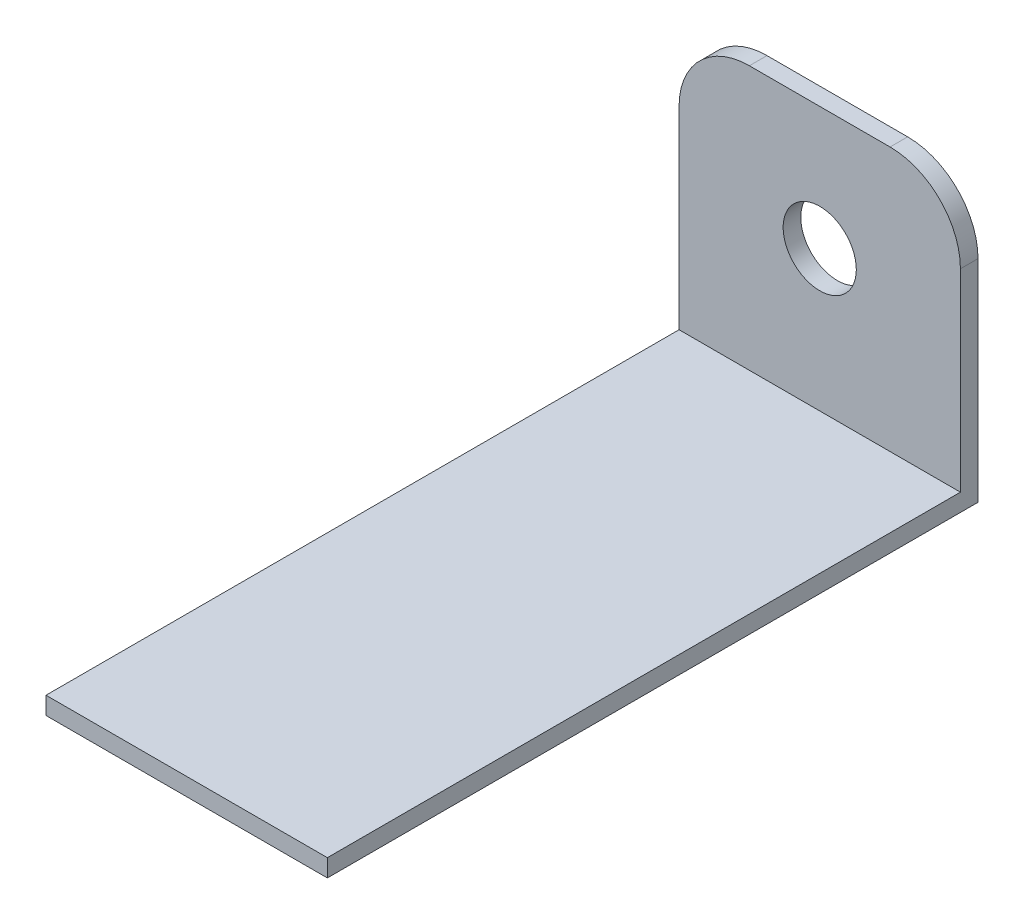
ISO-10303-21;
HEADER;
FILE_DESCRIPTION(('STEP AP214'),'2;1');
FILE_NAME('part.step','',(''),(''),'','','');
FILE_SCHEMA(('AUTOMOTIVE_DESIGN { 1 0 10303 214 1 1 1 1 }'));
ENDSEC;
DATA;
#1=APPLICATION_CONTEXT('core data for automotive mechanical design processes');
#2=APPLICATION_PROTOCOL_DEFINITION('international standard','automotive_design',2000,#1);
#3=PRODUCT_CONTEXT('',#1,'mechanical');
#4=PRODUCT('Part','Part','',(#3));
#5=PRODUCT_RELATED_PRODUCT_CATEGORY('part','',(#4));
#6=PRODUCT_DEFINITION_FORMATION('','',#4);
#7=PRODUCT_DEFINITION_CONTEXT('part definition',#1,'design');
#8=PRODUCT_DEFINITION('design','',#6,#7);
#9=PRODUCT_DEFINITION_SHAPE('','',#8);
#10=(LENGTH_UNIT() NAMED_UNIT(*) SI_UNIT(.MILLI.,.METRE.));
#11=(NAMED_UNIT(*) PLANE_ANGLE_UNIT() SI_UNIT($,.RADIAN.));
#12=(NAMED_UNIT(*) SI_UNIT($,.STERADIAN.) SOLID_ANGLE_UNIT());
#13=UNCERTAINTY_MEASURE_WITH_UNIT(LENGTH_MEASURE(1.E-05),#10,'distance_accuracy_value','');
#14=(GEOMETRIC_REPRESENTATION_CONTEXT(3) GLOBAL_UNCERTAINTY_ASSIGNED_CONTEXT((#13)) GLOBAL_UNIT_ASSIGNED_CONTEXT((#10,
#11,#12)) REPRESENTATION_CONTEXT('',''));
#15=CARTESIAN_POINT('',(0.,0.,0.));
#16=DIRECTION('',(0.,0.,1.));
#17=DIRECTION('',(1.,0.,0.));
#18=AXIS2_PLACEMENT_3D('',#15,#16,#17);
#19=CARTESIAN_POINT('',(0.,1.5875,0.));
#20=DIRECTION('',(1.,0.,0.));
#21=DIRECTION('',(0.,0.,-1.));
#22=AXIS2_PLACEMENT_3D('',#19,#20,#21);
#23=PLANE('',#22);
#24=DIRECTION('',(0.,1.,0.));
#25=VECTOR('',#24,1.);
#26=CARTESIAN_POINT('',(0.,0.,-57.15));
#27=LINE('',#26,#25);
#28=CARTESIAN_POINT('',(0.,1.5875,-57.15));
#29=VERTEX_POINT('',#28);
#30=CARTESIAN_POINT('',(0.,19.05,-57.15));
#31=VERTEX_POINT('',#30);
#32=EDGE_CURVE('E140',#29,#31,#27,.T.);
#33=ORIENTED_EDGE('',*,*,#32,.T.);
#34=DIRECTION('',(0.,0.,1.));
#35=VECTOR('',#34,1.);
#36=CARTESIAN_POINT('',(0.,19.05,0.));
#37=LINE('',#36,#35);
#38=CARTESIAN_POINT('',(0.,19.05,-58.7375));
#39=VERTEX_POINT('',#38);
#40=EDGE_CURVE('E11',#31,#39,#37,.F.);
#41=ORIENTED_EDGE('',*,*,#40,.T.);
#42=DIRECTION('',(0.,1.,0.));
#43=VECTOR('',#42,1.);
#44=CARTESIAN_POINT('',(0.,0.,-58.7375));
#45=LINE('',#44,#43);
#46=CARTESIAN_POINT('',(0.,0.,-58.7375));
#47=VERTEX_POINT('',#46);
#48=EDGE_CURVE('E131',#47,#39,#45,.T.);
#49=ORIENTED_EDGE('',*,*,#48,.F.);
#50=DIRECTION('',(0.,0.,1.));
#51=VECTOR('',#50,1.);
#52=CARTESIAN_POINT('',(0.,0.,0.));
#53=LINE('',#52,#51);
#54=CARTESIAN_POINT('',(0.,0.,0.));
#55=VERTEX_POINT('',#54);
#56=EDGE_CURVE('E130',#47,#55,#53,.T.);
#57=ORIENTED_EDGE('',*,*,#56,.T.);
#58=DIRECTION('',(0.,-1.,0.));
#59=VECTOR('',#58,1.);
#60=CARTESIAN_POINT('',(0.,1.5875,0.));
#61=LINE('',#60,#59);
#62=CARTESIAN_POINT('',(0.,1.5875,0.));
#63=VERTEX_POINT('',#62);
#64=EDGE_CURVE('E157',#63,#55,#61,.T.);
#65=ORIENTED_EDGE('',*,*,#64,.F.);
#66=DIRECTION('',(0.,0.,1.));
#67=VECTOR('',#66,1.);
#68=CARTESIAN_POINT('',(0.,1.5875,0.));
#69=LINE('',#68,#67);
#70=EDGE_CURVE('E125',#29,#63,#69,.T.);
#71=ORIENTED_EDGE('',*,*,#70,.F.);
#72=EDGE_LOOP('',(#33,#41,#49,#57,#65,#71));
#73=FACE_BOUND('',#72,.T.);
#74=ADVANCED_FACE('F39',(#73),#23,.F.);
#75=CARTESIAN_POINT('',(0.,1.5875,0.));
#76=DIRECTION('',(0.,0.,-1.));
#77=DIRECTION('',(-1.,0.,0.));
#78=AXIS2_PLACEMENT_3D('',#75,#76,#77);
#79=PLANE('',#78);
#80=DIRECTION('',(1.,0.,0.));
#81=VECTOR('',#80,1.);
#82=CARTESIAN_POINT('',(0.,0.,0.));
#83=LINE('',#82,#81);
#84=CARTESIAN_POINT('',(25.4,0.,0.));
#85=VERTEX_POINT('',#84);
#86=EDGE_CURVE('E126',#55,#85,#83,.T.);
#87=ORIENTED_EDGE('',*,*,#86,.T.);
#88=DIRECTION('',(0.,-1.,0.));
#89=VECTOR('',#88,1.);
#90=CARTESIAN_POINT('',(25.4,1.5875,0.));
#91=LINE('',#90,#89);
#92=CARTESIAN_POINT('',(25.4,1.5875,0.));
#93=VERTEX_POINT('',#92);
#94=EDGE_CURVE('E123',#93,#85,#91,.T.);
#95=ORIENTED_EDGE('',*,*,#94,.F.);
#96=DIRECTION('',(1.,0.,0.));
#97=VECTOR('',#96,1.);
#98=CARTESIAN_POINT('',(0.,1.5875,0.));
#99=LINE('',#98,#97);
#100=EDGE_CURVE('E146',#63,#93,#99,.T.);
#101=ORIENTED_EDGE('',*,*,#100,.F.);
#102=ORIENTED_EDGE('',*,*,#64,.T.);
#103=EDGE_LOOP('',(#87,#95,#101,#102));
#104=FACE_BOUND('',#103,.T.);
#105=ADVANCED_FACE('F197',(#104),#79,.F.);
#106=CARTESIAN_POINT('',(25.4,1.5875,0.));
#107=DIRECTION('',(-1.,0.,0.));
#108=DIRECTION('',(0.,0.,1.));
#109=AXIS2_PLACEMENT_3D('',#106,#107,#108);
#110=PLANE('',#109);
#111=DIRECTION('',(0.,-1.,0.));
#112=VECTOR('',#111,1.);
#113=CARTESIAN_POINT('',(25.4,0.,-58.7375));
#114=LINE('',#113,#112);
#115=CARTESIAN_POINT('',(25.4,19.05,-58.7375));
#116=VERTEX_POINT('',#115);
#117=CARTESIAN_POINT('',(25.4,0.,-58.7375));
#118=VERTEX_POINT('',#117);
#119=EDGE_CURVE('E106',#116,#118,#114,.T.);
#120=ORIENTED_EDGE('',*,*,#119,.F.);
#121=DIRECTION('',(0.,0.,1.));
#122=VECTOR('',#121,1.);
#123=CARTESIAN_POINT('',(25.4,19.05,0.));
#124=LINE('',#123,#122);
#125=CARTESIAN_POINT('',(25.4,19.05,-57.15));
#126=VERTEX_POINT('',#125);
#127=EDGE_CURVE('E160',#116,#126,#124,.T.);
#128=ORIENTED_EDGE('',*,*,#127,.T.);
#129=DIRECTION('',(0.,-1.,0.));
#130=VECTOR('',#129,1.);
#131=CARTESIAN_POINT('',(25.4,0.,-57.15));
#132=LINE('',#131,#130);
#133=CARTESIAN_POINT('',(25.4,1.5875,-57.15));
#134=VERTEX_POINT('',#133);
#135=EDGE_CURVE('E138',#126,#134,#132,.T.);
#136=ORIENTED_EDGE('',*,*,#135,.T.);
#137=DIRECTION('',(0.,0.,-1.));
#138=VECTOR('',#137,1.);
#139=CARTESIAN_POINT('',(25.4,1.5875,0.));
#140=LINE('',#139,#138);
#141=EDGE_CURVE('E148',#93,#134,#140,.T.);
#142=ORIENTED_EDGE('',*,*,#141,.F.);
#143=ORIENTED_EDGE('',*,*,#94,.T.);
#144=DIRECTION('',(0.,0.,-1.));
#145=VECTOR('',#144,1.);
#146=CARTESIAN_POINT('',(25.4,0.,0.));
#147=LINE('',#146,#145);
#148=EDGE_CURVE('E119',#85,#118,#147,.T.);
#149=ORIENTED_EDGE('',*,*,#148,.T.);
#150=EDGE_LOOP('',(#120,#128,#136,#142,#143,#149));
#151=FACE_BOUND('',#150,.T.);
#152=ADVANCED_FACE('F120',(#151),#110,.F.);
#153=CARTESIAN_POINT('',(0.,1.5875,0.));
#154=DIRECTION('',(0.,-1.,0.));
#155=DIRECTION('',(0.,0.,-1.));
#156=AXIS2_PLACEMENT_3D('',#153,#154,#155);
#157=PLANE('',#156);
#158=ORIENTED_EDGE('',*,*,#70,.T.);
#159=ORIENTED_EDGE('',*,*,#100,.T.);
#160=ORIENTED_EDGE('',*,*,#141,.T.);
#161=DIRECTION('',(-1.,0.,0.));
#162=VECTOR('',#161,1.);
#163=CARTESIAN_POINT('',(0.,1.5875,-57.15));
#164=LINE('',#163,#162);
#165=EDGE_CURVE('E151',#134,#29,#164,.T.);
#166=ORIENTED_EDGE('',*,*,#165,.T.);
#167=EDGE_LOOP('',(#158,#159,#160,#166));
#168=FACE_BOUND('',#167,.T.);
#169=ADVANCED_FACE('F183',(#168),#157,.F.);
#170=CARTESIAN_POINT('',(0.,0.,0.));
#171=DIRECTION('',(0.,-1.,0.));
#172=DIRECTION('',(0.,0.,-1.));
#173=AXIS2_PLACEMENT_3D('',#170,#171,#172);
#174=PLANE('',#173);
#175=ORIENTED_EDGE('',*,*,#56,.F.);
#176=DIRECTION('',(-1.,0.,0.));
#177=VECTOR('',#176,1.);
#178=CARTESIAN_POINT('',(25.4,0.,-58.7375));
#179=LINE('',#178,#177);
#180=EDGE_CURVE('E110',#118,#47,#179,.T.);
#181=ORIENTED_EDGE('',*,*,#180,.F.);
#182=ORIENTED_EDGE('',*,*,#148,.F.);
#183=ORIENTED_EDGE('',*,*,#86,.F.);
#184=EDGE_LOOP('',(#175,#181,#182,#183));
#185=FACE_BOUND('',#184,.T.);
#186=ADVANCED_FACE('F128',(#185),#174,.T.);
#187=CARTESIAN_POINT('',(0.,0.,-57.15));
#188=DIRECTION('',(0.,0.,1.));
#189=DIRECTION('',(1.,0.,0.));
#190=AXIS2_PLACEMENT_3D('',#187,#188,#189);
#191=PLANE('',#190);
#192=CARTESIAN_POINT('',(12.7,14.2875,-57.15));
#193=DIRECTION('',(0.,0.,1.));
#194=DIRECTION('',(1.,0.,0.));
#195=AXIS2_PLACEMENT_3D('',#192,#193,#194);
#196=CIRCLE('',#195,3.302);
#197=CARTESIAN_POINT('',(16.002,14.2875,-57.15));
#198=VERTEX_POINT('',#197);
#199=EDGE_CURVE('E220',#198,#198,#196,.T.);
#200=ORIENTED_EDGE('',*,*,#199,.F.);
#201=EDGE_LOOP('',(#200));
#202=FACE_BOUND('',#201,.T.);
#203=ORIENTED_EDGE('',*,*,#135,.F.);
#204=CARTESIAN_POINT('',(19.05,19.05,-57.15));
#205=DIRECTION('',(0.,0.,1.));
#206=DIRECTION('',(1.,0.,0.));
#207=AXIS2_PLACEMENT_3D('',#204,#205,#206);
#208=CIRCLE('',#207,6.35);
#209=CARTESIAN_POINT('',(19.05,25.4,-57.15));
#210=VERTEX_POINT('',#209);
#211=EDGE_CURVE('E164',#126,#210,#208,.T.);
#212=ORIENTED_EDGE('',*,*,#211,.T.);
#213=DIRECTION('',(1.,0.,0.));
#214=VECTOR('',#213,1.);
#215=CARTESIAN_POINT('',(25.4,25.4,-57.15));
#216=LINE('',#215,#214);
#217=CARTESIAN_POINT('',(6.35,25.4,-57.15));
#218=VERTEX_POINT('',#217);
#219=EDGE_CURVE('E115',#218,#210,#216,.T.);
#220=ORIENTED_EDGE('',*,*,#219,.F.);
#221=CARTESIAN_POINT('',(6.35,19.05,-57.15));
#222=DIRECTION('',(0.,0.,1.));
#223=DIRECTION('',(1.,0.,0.));
#224=AXIS2_PLACEMENT_3D('',#221,#222,#223);
#225=CIRCLE('',#224,6.35);
#226=EDGE_CURVE('E162',#218,#31,#225,.T.);
#227=ORIENTED_EDGE('',*,*,#226,.T.);
#228=ORIENTED_EDGE('',*,*,#32,.F.);
#229=ORIENTED_EDGE('',*,*,#165,.F.);
#230=EDGE_LOOP('',(#203,#212,#220,#227,#228,#229));
#231=FACE_BOUND('',#230,.T.);
#232=ADVANCED_FACE('F178',(#202,#231),#191,.T.);
#233=CARTESIAN_POINT('',(25.4,25.4,-58.7375));
#234=DIRECTION('',(0.,-1.,0.));
#235=DIRECTION('',(0.,0.,-1.));
#236=AXIS2_PLACEMENT_3D('',#233,#234,#235);
#237=PLANE('',#236);
#238=ORIENTED_EDGE('',*,*,#219,.T.);
#239=DIRECTION('',(0.,0.,1.));
#240=VECTOR('',#239,1.);
#241=CARTESIAN_POINT('',(19.05,25.4,-58.7375));
#242=LINE('',#241,#240);
#243=CARTESIAN_POINT('',(19.05,25.4,-58.7375));
#244=VERTEX_POINT('',#243);
#245=EDGE_CURVE('E60',#210,#244,#242,.F.);
#246=ORIENTED_EDGE('',*,*,#245,.T.);
#247=DIRECTION('',(1.,0.,0.));
#248=VECTOR('',#247,1.);
#249=CARTESIAN_POINT('',(25.4,25.4,-58.7375));
#250=LINE('',#249,#248);
#251=CARTESIAN_POINT('',(6.35,25.4,-58.7375));
#252=VERTEX_POINT('',#251);
#253=EDGE_CURVE('E133',#252,#244,#250,.T.);
#254=ORIENTED_EDGE('',*,*,#253,.F.);
#255=DIRECTION('',(0.,0.,1.));
#256=VECTOR('',#255,1.);
#257=CARTESIAN_POINT('',(6.35,25.4,-58.7375));
#258=LINE('',#257,#256);
#259=EDGE_CURVE('E166',#252,#218,#258,.T.);
#260=ORIENTED_EDGE('',*,*,#259,.T.);
#261=EDGE_LOOP('',(#238,#246,#254,#260));
#262=FACE_BOUND('',#261,.T.);
#263=ADVANCED_FACE('F174',(#262),#237,.F.);
#264=CARTESIAN_POINT('',(0.,0.,-58.7375));
#265=DIRECTION('',(0.,0.,1.));
#266=DIRECTION('',(1.,0.,0.));
#267=AXIS2_PLACEMENT_3D('',#264,#265,#266);
#268=PLANE('',#267);
#269=CARTESIAN_POINT('',(12.7,14.2875,-58.7375));
#270=DIRECTION('',(0.,0.,1.));
#271=DIRECTION('',(1.,0.,0.));
#272=AXIS2_PLACEMENT_3D('',#269,#270,#271);
#273=CIRCLE('',#272,3.302);
#274=CARTESIAN_POINT('',(16.002,14.2875,-58.7375));
#275=VERTEX_POINT('',#274);
#276=EDGE_CURVE('E141',#275,#275,#273,.T.);
#277=ORIENTED_EDGE('',*,*,#276,.T.);
#278=EDGE_LOOP('',(#277));
#279=FACE_BOUND('',#278,.T.);
#280=ORIENTED_EDGE('',*,*,#253,.T.);
#281=CARTESIAN_POINT('',(19.05,19.05,-58.7375));
#282=DIRECTION('',(0.,0.,1.));
#283=DIRECTION('',(1.,0.,0.));
#284=AXIS2_PLACEMENT_3D('',#281,#282,#283);
#285=CIRCLE('',#284,6.35);
#286=EDGE_CURVE('E47',#244,#116,#285,.F.);
#287=ORIENTED_EDGE('',*,*,#286,.T.);
#288=ORIENTED_EDGE('',*,*,#119,.T.);
#289=ORIENTED_EDGE('',*,*,#180,.T.);
#290=ORIENTED_EDGE('',*,*,#48,.T.);
#291=CARTESIAN_POINT('',(6.35,19.05,-58.7375));
#292=DIRECTION('',(0.,0.,1.));
#293=DIRECTION('',(1.,0.,0.));
#294=AXIS2_PLACEMENT_3D('',#291,#292,#293);
#295=CIRCLE('',#294,6.35);
#296=EDGE_CURVE('E170',#39,#252,#295,.F.);
#297=ORIENTED_EDGE('',*,*,#296,.T.);
#298=EDGE_LOOP('',(#280,#287,#288,#289,#290,#297));
#299=FACE_BOUND('',#298,.T.);
#300=ADVANCED_FACE('F108',(#279,#299),#268,.F.);
#301=CARTESIAN_POINT('',(12.7,14.2875,-58.7375));
#302=DIRECTION('',(0.,0.,1.));
#303=DIRECTION('',(1.,0.,0.));
#304=AXIS2_PLACEMENT_3D('',#301,#302,#303);
#305=CYLINDRICAL_SURFACE('',#304,3.302);
#306=ORIENTED_EDGE('',*,*,#276,.F.);
#307=EDGE_LOOP('',(#306));
#308=FACE_BOUND('',#307,.T.);
#309=ORIENTED_EDGE('',*,*,#199,.T.);
#310=EDGE_LOOP('',(#309));
#311=FACE_BOUND('',#310,.T.);
#312=ADVANCED_FACE('F187',(#308,#311),#305,.F.);
#313=CARTESIAN_POINT('',(19.05,19.05,0.));
#314=DIRECTION('',(0.,0.,1.));
#315=DIRECTION('',(1.,0.,0.));
#316=AXIS2_PLACEMENT_3D('',#313,#314,#315);
#317=CYLINDRICAL_SURFACE('',#316,6.35);
#318=ORIENTED_EDGE('',*,*,#286,.F.);
#319=ORIENTED_EDGE('',*,*,#245,.F.);
#320=ORIENTED_EDGE('',*,*,#211,.F.);
#321=ORIENTED_EDGE('',*,*,#127,.F.);
#322=EDGE_LOOP('',(#318,#319,#320,#321));
#323=FACE_BOUND('',#322,.T.);
#324=ADVANCED_FACE('F185',(#323),#317,.T.);
#325=CARTESIAN_POINT('',(6.35,19.05,-58.7375));
#326=DIRECTION('',(0.,0.,1.));
#327=DIRECTION('',(1.,0.,0.));
#328=AXIS2_PLACEMENT_3D('',#325,#326,#327);
#329=CYLINDRICAL_SURFACE('',#328,6.35);
#330=ORIENTED_EDGE('',*,*,#296,.F.);
#331=ORIENTED_EDGE('',*,*,#40,.F.);
#332=ORIENTED_EDGE('',*,*,#226,.F.);
#333=ORIENTED_EDGE('',*,*,#259,.F.);
#334=EDGE_LOOP('',(#330,#331,#332,#333));
#335=FACE_BOUND('',#334,.T.);
#336=ADVANCED_FACE('F41',(#335),#329,.T.);
#337=CLOSED_SHELL('',(#74,#105,#152,#169,#186,#232,#263,#300,#312,#324,#336));
#338=MANIFOLD_SOLID_BREP('B2',#337);
#339=ADVANCED_BREP_SHAPE_REPRESENTATION('',(#18,#338),#14);
#340=SHAPE_DEFINITION_REPRESENTATION(#9,#339);
ENDSEC;
END-ISO-10303-21;
